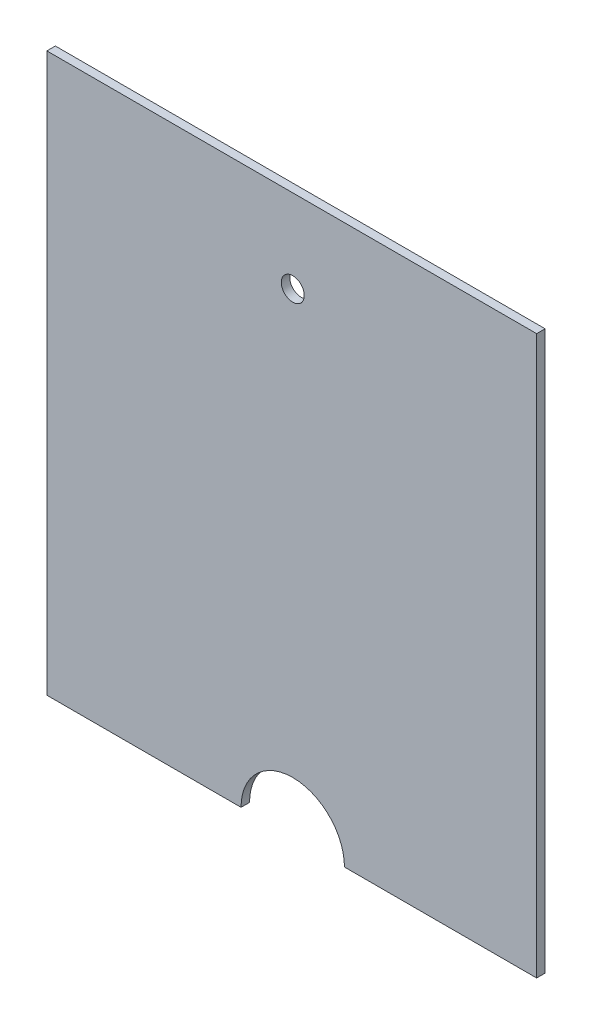
ISO-10303-21;
HEADER;
FILE_DESCRIPTION(('STEP AP214'),'2;1');
FILE_NAME('part.step','',(''),(''),'','','');
FILE_SCHEMA(('AUTOMOTIVE_DESIGN { 1 0 10303 214 1 1 1 1 }'));
ENDSEC;
DATA;
#1=APPLICATION_CONTEXT('core data for automotive mechanical design processes');
#2=APPLICATION_PROTOCOL_DEFINITION('international standard','automotive_design',2000,#1);
#3=PRODUCT_CONTEXT('',#1,'mechanical');
#4=PRODUCT('Part','Part','',(#3));
#5=PRODUCT_RELATED_PRODUCT_CATEGORY('part','',(#4));
#6=PRODUCT_DEFINITION_FORMATION('','',#4);
#7=PRODUCT_DEFINITION_CONTEXT('part definition',#1,'design');
#8=PRODUCT_DEFINITION('design','',#6,#7);
#9=PRODUCT_DEFINITION_SHAPE('','',#8);
#10=(LENGTH_UNIT() NAMED_UNIT(*) SI_UNIT(.MILLI.,.METRE.));
#11=(NAMED_UNIT(*) PLANE_ANGLE_UNIT() SI_UNIT($,.RADIAN.));
#12=(NAMED_UNIT(*) SI_UNIT($,.STERADIAN.) SOLID_ANGLE_UNIT());
#13=UNCERTAINTY_MEASURE_WITH_UNIT(LENGTH_MEASURE(1.E-05),#10,'distance_accuracy_value','');
#14=(GEOMETRIC_REPRESENTATION_CONTEXT(3) GLOBAL_UNCERTAINTY_ASSIGNED_CONTEXT((#13)) GLOBAL_UNIT_ASSIGNED_CONTEXT((#10,
#11,#12)) REPRESENTATION_CONTEXT('',''));
#15=CARTESIAN_POINT('',(0.,0.,0.));
#16=DIRECTION('',(0.,0.,1.));
#17=DIRECTION('',(1.,0.,0.));
#18=AXIS2_PLACEMENT_3D('',#15,#16,#17);
#19=CARTESIAN_POINT('',(-49.5525588676988,-112.698412698413,2.95));
#20=DIRECTION('',(0.,0.,1.));
#21=DIRECTION('',(1.,0.,0.));
#22=AXIS2_PLACEMENT_3D('',#19,#20,#21);
#23=PLANE('',#22);
#24=DIRECTION('',(-1.,0.,0.));
#25=VECTOR('',#24,1.);
#26=CARTESIAN_POINT('',(-135.147392290249,81.5715873015873,2.95));
#27=LINE('',#26,#25);
#28=CARTESIAN_POINT('',(35.3526077097505,81.5715873015873,2.95));
#29=VERTEX_POINT('',#28);
#30=CARTESIAN_POINT('',(-135.147392290249,81.5715873015873,2.95));
#31=VERTEX_POINT('',#30);
#32=EDGE_CURVE('E129',#29,#31,#27,.T.);
#33=ORIENTED_EDGE('',*,*,#32,.T.);
#34=DIRECTION('',(0.,-1.,0.));
#35=VECTOR('',#34,1.);
#36=CARTESIAN_POINT('',(-135.147392290249,81.5715873015873,2.95));
#37=LINE('',#36,#35);
#38=CARTESIAN_POINT('',(-135.147392290249,-112.698412698413,2.95));
#39=VERTEX_POINT('',#38);
#40=EDGE_CURVE('E87',#31,#39,#37,.T.);
#41=ORIENTED_EDGE('',*,*,#40,.T.);
#42=DIRECTION('',(1.,0.,0.));
#43=VECTOR('',#42,1.);
#44=CARTESIAN_POINT('',(-135.147392290249,-112.698412698413,2.95));
#45=LINE('',#44,#43);
#46=CARTESIAN_POINT('',(-67.5525588676988,-112.698412698413,2.95));
#47=VERTEX_POINT('',#46);
#48=EDGE_CURVE('E100',#39,#47,#45,.T.);
#49=ORIENTED_EDGE('',*,*,#48,.T.);
#50=CARTESIAN_POINT('',(-49.5525588676988,-112.698412698413,2.95));
#51=DIRECTION('',(0.,0.,-1.));
#52=DIRECTION('',(1.,0.,0.));
#53=AXIS2_PLACEMENT_3D('',#50,#51,#52);
#54=CIRCLE('',#53,18.);
#55=CARTESIAN_POINT('',(-31.5525588676988,-112.698412698413,2.95));
#56=VERTEX_POINT('',#55);
#57=EDGE_CURVE('E94',#47,#56,#54,.T.);
#58=ORIENTED_EDGE('',*,*,#57,.T.);
#59=DIRECTION('',(1.,0.,0.));
#60=VECTOR('',#59,1.);
#61=CARTESIAN_POINT('',(-31.5525588676988,-112.698412698413,2.95));
#62=LINE('',#61,#60);
#63=CARTESIAN_POINT('',(35.3526077097505,-112.698412698413,2.95));
#64=VERTEX_POINT('',#63);
#65=EDGE_CURVE('E98',#56,#64,#62,.T.);
#66=ORIENTED_EDGE('',*,*,#65,.T.);
#67=DIRECTION('',(0.,1.,0.));
#68=VECTOR('',#67,1.);
#69=CARTESIAN_POINT('',(35.3526077097505,81.5715873015873,2.95));
#70=LINE('',#69,#68);
#71=EDGE_CURVE('E50',#64,#29,#70,.T.);
#72=ORIENTED_EDGE('',*,*,#71,.T.);
#73=EDGE_LOOP('',(#33,#41,#49,#58,#66,#72));
#74=FACE_BOUND('',#73,.T.);
#75=CARTESIAN_POINT('',(-49.5525588676988,52.6043293008879,2.95));
#76=DIRECTION('',(0.,0.,1.));
#77=DIRECTION('',(1.,0.,0.));
#78=AXIS2_PLACEMENT_3D('',#75,#76,#77);
#79=CIRCLE('',#78,4.00000000000001);
#80=CARTESIAN_POINT('',(-45.5525588676988,52.6043293008879,2.95));
#81=VERTEX_POINT('',#80);
#82=EDGE_CURVE('E122',#81,#81,#79,.T.);
#83=ORIENTED_EDGE('',*,*,#82,.F.);
#84=EDGE_LOOP('',(#83));
#85=FACE_BOUND('',#84,.T.);
#86=ADVANCED_FACE('F33',(#74,#85),#23,.T.);
#87=CARTESIAN_POINT('',(-49.5525588676988,-112.698412698413,0.));
#88=DIRECTION('',(0.,0.,1.));
#89=DIRECTION('',(1.,0.,0.));
#90=AXIS2_PLACEMENT_3D('',#87,#88,#89);
#91=PLANE('',#90);
#92=DIRECTION('',(-1.,0.,0.));
#93=VECTOR('',#92,1.);
#94=CARTESIAN_POINT('',(-135.147392290249,81.5715873015873,0.));
#95=LINE('',#94,#93);
#96=CARTESIAN_POINT('',(35.3526077097505,81.5715873015873,0.));
#97=VERTEX_POINT('',#96);
#98=CARTESIAN_POINT('',(-135.147392290249,81.5715873015873,0.));
#99=VERTEX_POINT('',#98);
#100=EDGE_CURVE('E118',#97,#99,#95,.T.);
#101=ORIENTED_EDGE('',*,*,#100,.F.);
#102=DIRECTION('',(0.,1.,0.));
#103=VECTOR('',#102,1.);
#104=CARTESIAN_POINT('',(35.3526077097505,81.5715873015873,0.));
#105=LINE('',#104,#103);
#106=CARTESIAN_POINT('',(35.3526077097505,-112.698412698413,0.));
#107=VERTEX_POINT('',#106);
#108=EDGE_CURVE('E79',#107,#97,#105,.T.);
#109=ORIENTED_EDGE('',*,*,#108,.F.);
#110=DIRECTION('',(1.,0.,0.));
#111=VECTOR('',#110,1.);
#112=CARTESIAN_POINT('',(-31.5525588676988,-112.698412698413,0.));
#113=LINE('',#112,#111);
#114=CARTESIAN_POINT('',(-31.5525588676988,-112.698412698413,0.));
#115=VERTEX_POINT('',#114);
#116=EDGE_CURVE('E73',#115,#107,#113,.T.);
#117=ORIENTED_EDGE('',*,*,#116,.F.);
#118=CARTESIAN_POINT('',(-49.5525588676988,-112.698412698413,0.));
#119=DIRECTION('',(0.,0.,-1.));
#120=DIRECTION('',(1.,0.,0.));
#121=AXIS2_PLACEMENT_3D('',#118,#119,#120);
#122=CIRCLE('',#121,18.);
#123=CARTESIAN_POINT('',(-67.5525588676988,-112.698412698413,0.));
#124=VERTEX_POINT('',#123);
#125=EDGE_CURVE('E108',#124,#115,#122,.T.);
#126=ORIENTED_EDGE('',*,*,#125,.F.);
#127=DIRECTION('',(1.,0.,0.));
#128=VECTOR('',#127,1.);
#129=CARTESIAN_POINT('',(-135.147392290249,-112.698412698413,0.));
#130=LINE('',#129,#128);
#131=CARTESIAN_POINT('',(-135.147392290249,-112.698412698413,0.));
#132=VERTEX_POINT('',#131);
#133=EDGE_CURVE('E124',#132,#124,#130,.T.);
#134=ORIENTED_EDGE('',*,*,#133,.F.);
#135=DIRECTION('',(0.,-1.,0.));
#136=VECTOR('',#135,1.);
#137=CARTESIAN_POINT('',(-135.147392290249,81.5715873015873,0.));
#138=LINE('',#137,#136);
#139=EDGE_CURVE('E121',#99,#132,#138,.T.);
#140=ORIENTED_EDGE('',*,*,#139,.F.);
#141=EDGE_LOOP('',(#101,#109,#117,#126,#134,#140));
#142=FACE_BOUND('',#141,.T.);
#143=CARTESIAN_POINT('',(-49.5525588676988,52.6043293008879,0.));
#144=DIRECTION('',(0.,0.,1.));
#145=DIRECTION('',(1.,0.,0.));
#146=AXIS2_PLACEMENT_3D('',#143,#144,#145);
#147=CIRCLE('',#146,4.00000000000001);
#148=CARTESIAN_POINT('',(-45.5525588676988,52.6043293008879,0.));
#149=VERTEX_POINT('',#148);
#150=EDGE_CURVE('E222',#149,#149,#147,.T.);
#151=ORIENTED_EDGE('',*,*,#150,.T.);
#152=EDGE_LOOP('',(#151));
#153=FACE_BOUND('',#152,.T.);
#154=ADVANCED_FACE('F138',(#142,#153),#91,.F.);
#155=CARTESIAN_POINT('',(-135.147392290249,81.5715873015873,2.95));
#156=DIRECTION('',(0.,-1.,0.));
#157=DIRECTION('',(0.,0.,-1.));
#158=AXIS2_PLACEMENT_3D('',#155,#156,#157);
#159=PLANE('',#158);
#160=ORIENTED_EDGE('',*,*,#100,.T.);
#161=DIRECTION('',(0.,0.,-1.));
#162=VECTOR('',#161,1.);
#163=CARTESIAN_POINT('',(-135.147392290249,81.5715873015873,2.95));
#164=LINE('',#163,#162);
#165=EDGE_CURVE('E11',#31,#99,#164,.T.);
#166=ORIENTED_EDGE('',*,*,#165,.F.);
#167=ORIENTED_EDGE('',*,*,#32,.F.);
#168=DIRECTION('',(0.,0.,-1.));
#169=VECTOR('',#168,1.);
#170=CARTESIAN_POINT('',(35.3526077097505,81.5715873015873,2.95));
#171=LINE('',#170,#169);
#172=EDGE_CURVE('E114',#29,#97,#171,.T.);
#173=ORIENTED_EDGE('',*,*,#172,.T.);
#174=EDGE_LOOP('',(#160,#166,#167,#173));
#175=FACE_BOUND('',#174,.T.);
#176=ADVANCED_FACE('F35',(#175),#159,.F.);
#177=CARTESIAN_POINT('',(-135.147392290249,81.5715873015873,2.95));
#178=DIRECTION('',(1.,0.,0.));
#179=DIRECTION('',(0.,0.,-1.));
#180=AXIS2_PLACEMENT_3D('',#177,#178,#179);
#181=PLANE('',#180);
#182=ORIENTED_EDGE('',*,*,#139,.T.);
#183=DIRECTION('',(0.,0.,-1.));
#184=VECTOR('',#183,1.);
#185=CARTESIAN_POINT('',(-135.147392290249,-112.698412698413,2.95));
#186=LINE('',#185,#184);
#187=EDGE_CURVE('E42',#39,#132,#186,.T.);
#188=ORIENTED_EDGE('',*,*,#187,.F.);
#189=ORIENTED_EDGE('',*,*,#40,.F.);
#190=ORIENTED_EDGE('',*,*,#165,.T.);
#191=EDGE_LOOP('',(#182,#188,#189,#190));
#192=FACE_BOUND('',#191,.T.);
#193=ADVANCED_FACE('F163',(#192),#181,.F.);
#194=CARTESIAN_POINT('',(-135.147392290249,-112.698412698413,2.95));
#195=DIRECTION('',(0.,1.,0.));
#196=DIRECTION('',(0.,0.,1.));
#197=AXIS2_PLACEMENT_3D('',#194,#195,#196);
#198=PLANE('',#197);
#199=ORIENTED_EDGE('',*,*,#133,.T.);
#200=DIRECTION('',(0.,0.,-1.));
#201=VECTOR('',#200,1.);
#202=CARTESIAN_POINT('',(-67.5525588676988,-112.698412698413,2.95));
#203=LINE('',#202,#201);
#204=EDGE_CURVE('E109',#47,#124,#203,.T.);
#205=ORIENTED_EDGE('',*,*,#204,.F.);
#206=ORIENTED_EDGE('',*,*,#48,.F.);
#207=ORIENTED_EDGE('',*,*,#187,.T.);
#208=EDGE_LOOP('',(#199,#205,#206,#207));
#209=FACE_BOUND('',#208,.T.);
#210=ADVANCED_FACE('F135',(#209),#198,.F.);
#211=CARTESIAN_POINT('',(-49.5525588676988,-112.698412698413,2.95));
#212=DIRECTION('',(0.,0.,-1.));
#213=DIRECTION('',(-1.,0.,0.));
#214=AXIS2_PLACEMENT_3D('',#211,#212,#213);
#215=CYLINDRICAL_SURFACE('',#214,18.);
#216=ORIENTED_EDGE('',*,*,#125,.T.);
#217=DIRECTION('',(0.,0.,-1.));
#218=VECTOR('',#217,1.);
#219=CARTESIAN_POINT('',(-31.5525588676988,-112.698412698413,2.95));
#220=LINE('',#219,#218);
#221=EDGE_CURVE('E105',#56,#115,#220,.T.);
#222=ORIENTED_EDGE('',*,*,#221,.F.);
#223=ORIENTED_EDGE('',*,*,#57,.F.);
#224=ORIENTED_EDGE('',*,*,#204,.T.);
#225=EDGE_LOOP('',(#216,#222,#223,#224));
#226=FACE_BOUND('',#225,.T.);
#227=ADVANCED_FACE('F106',(#226),#215,.F.);
#228=CARTESIAN_POINT('',(-31.5525588676988,-112.698412698413,2.95));
#229=DIRECTION('',(0.,1.,0.));
#230=DIRECTION('',(0.,0.,1.));
#231=AXIS2_PLACEMENT_3D('',#228,#229,#230);
#232=PLANE('',#231);
#233=ORIENTED_EDGE('',*,*,#116,.T.);
#234=DIRECTION('',(0.,0.,-1.));
#235=VECTOR('',#234,1.);
#236=CARTESIAN_POINT('',(35.3526077097505,-112.698412698413,2.95));
#237=LINE('',#236,#235);
#238=EDGE_CURVE('E110',#64,#107,#237,.T.);
#239=ORIENTED_EDGE('',*,*,#238,.F.);
#240=ORIENTED_EDGE('',*,*,#65,.F.);
#241=ORIENTED_EDGE('',*,*,#221,.T.);
#242=EDGE_LOOP('',(#233,#239,#240,#241));
#243=FACE_BOUND('',#242,.T.);
#244=ADVANCED_FACE('F112',(#243),#232,.F.);
#245=CARTESIAN_POINT('',(35.3526077097505,81.5715873015873,2.95));
#246=DIRECTION('',(-1.,0.,0.));
#247=DIRECTION('',(0.,-1.,0.));
#248=AXIS2_PLACEMENT_3D('',#245,#246,#247);
#249=PLANE('',#248);
#250=ORIENTED_EDGE('',*,*,#108,.T.);
#251=ORIENTED_EDGE('',*,*,#172,.F.);
#252=ORIENTED_EDGE('',*,*,#71,.F.);
#253=ORIENTED_EDGE('',*,*,#238,.T.);
#254=EDGE_LOOP('',(#250,#251,#252,#253));
#255=FACE_BOUND('',#254,.T.);
#256=ADVANCED_FACE('F143',(#255),#249,.F.);
#257=CARTESIAN_POINT('',(-49.5525588676988,52.6043293008879,2.95));
#258=DIRECTION('',(0.,0.,-1.));
#259=DIRECTION('',(-1.,0.,0.));
#260=AXIS2_PLACEMENT_3D('',#257,#258,#259);
#261=CYLINDRICAL_SURFACE('',#260,4.00000000000001);
#262=ORIENTED_EDGE('',*,*,#82,.T.);
#263=EDGE_LOOP('',(#262));
#264=FACE_BOUND('',#263,.T.);
#265=ORIENTED_EDGE('',*,*,#150,.F.);
#266=EDGE_LOOP('',(#265));
#267=FACE_BOUND('',#266,.T.);
#268=ADVANCED_FACE('F145',(#264,#267),#261,.F.);
#269=CLOSED_SHELL('',(#86,#154,#176,#193,#210,#227,#244,#256,#268));
#270=MANIFOLD_SOLID_BREP('B2',#269);
#271=ADVANCED_BREP_SHAPE_REPRESENTATION('',(#18,#270),#14);
#272=SHAPE_DEFINITION_REPRESENTATION(#9,#271);
ENDSEC;
END-ISO-10303-21;
